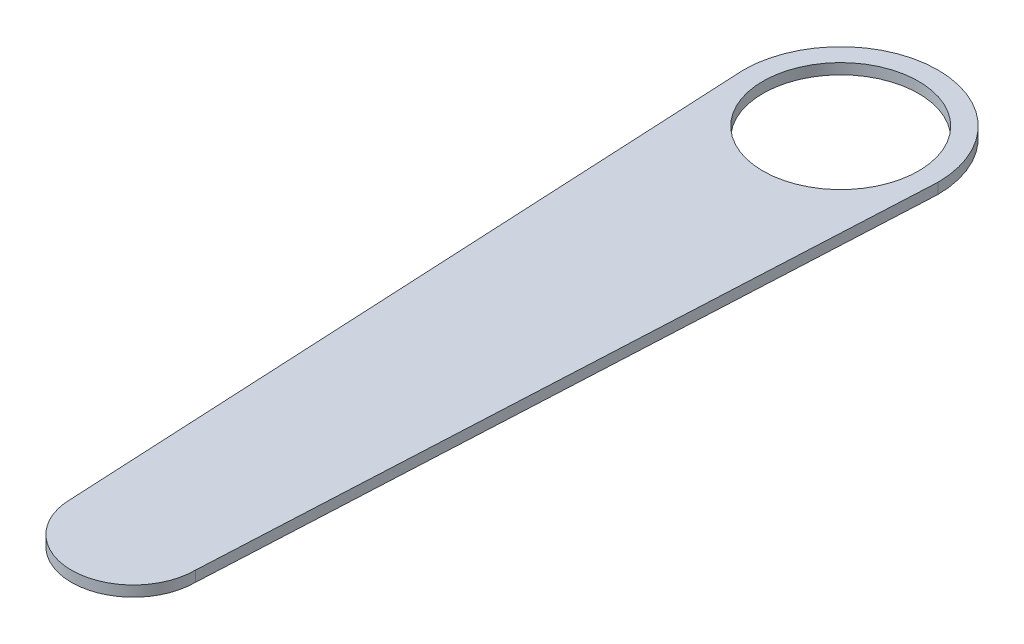
ISO-10303-21;
HEADER;
FILE_DESCRIPTION(('STEP AP214'),'2;1');
FILE_NAME('part.step','',(''),(''),'','','');
FILE_SCHEMA(('AUTOMOTIVE_DESIGN { 1 0 10303 214 1 1 1 1 }'));
ENDSEC;
DATA;
#1=APPLICATION_CONTEXT('core data for automotive mechanical design processes');
#2=APPLICATION_PROTOCOL_DEFINITION('international standard','automotive_design',2000,#1);
#3=PRODUCT_CONTEXT('',#1,'mechanical');
#4=PRODUCT('Part','Part','',(#3));
#5=PRODUCT_RELATED_PRODUCT_CATEGORY('part','',(#4));
#6=PRODUCT_DEFINITION_FORMATION('','',#4);
#7=PRODUCT_DEFINITION_CONTEXT('part definition',#1,'design');
#8=PRODUCT_DEFINITION('design','',#6,#7);
#9=PRODUCT_DEFINITION_SHAPE('','',#8);
#10=(LENGTH_UNIT() NAMED_UNIT(*) SI_UNIT(.MILLI.,.METRE.));
#11=(NAMED_UNIT(*) PLANE_ANGLE_UNIT() SI_UNIT($,.RADIAN.));
#12=(NAMED_UNIT(*) SI_UNIT($,.STERADIAN.) SOLID_ANGLE_UNIT());
#13=UNCERTAINTY_MEASURE_WITH_UNIT(LENGTH_MEASURE(1.E-05),#10,'distance_accuracy_value','');
#14=(GEOMETRIC_REPRESENTATION_CONTEXT(3) GLOBAL_UNCERTAINTY_ASSIGNED_CONTEXT((#13)) GLOBAL_UNIT_ASSIGNED_CONTEXT((#10,
#11,#12)) REPRESENTATION_CONTEXT('',''));
#15=CARTESIAN_POINT('',(0.,0.,0.));
#16=DIRECTION('',(0.,0.,1.));
#17=DIRECTION('',(1.,0.,0.));
#18=AXIS2_PLACEMENT_3D('',#15,#16,#17);
#19=CARTESIAN_POINT('',(27.431421446384,3.,1.3715710723192));
#20=DIRECTION('',(-0.998752338877845,0.,-0.0499376169438922));
#21=DIRECTION('',(-0.0499376169438922,0.,0.998752338877845));
#22=AXIS2_PLACEMENT_3D('',#19,#20,#21);
#23=PLANE('',#22);
#24=DIRECTION('',(0.0499376169438922,0.,-0.998752338877845));
#25=VECTOR('',#24,1.);
#26=CARTESIAN_POINT('',(27.431421446384,0.,1.3715710723192));
#27=LINE('',#26,#25);
#28=CARTESIAN_POINT('',(17.5,0.,200.));
#29=VERTEX_POINT('',#28);
#30=CARTESIAN_POINT('',(27.5,0.,0.));
#31=VERTEX_POINT('',#30);
#32=EDGE_CURVE('E107',#29,#31,#27,.T.);
#33=ORIENTED_EDGE('',*,*,#32,.T.);
#34=DIRECTION('',(0.,-1.,0.));
#35=VECTOR('',#34,1.);
#36=CARTESIAN_POINT('',(27.5,3.,0.));
#37=LINE('',#36,#35);
#38=CARTESIAN_POINT('',(27.5,3.,0.));
#39=VERTEX_POINT('',#38);
#40=EDGE_CURVE('E11',#39,#31,#37,.T.);
#41=ORIENTED_EDGE('',*,*,#40,.F.);
#42=DIRECTION('',(0.0499376169438922,0.,-0.998752338877845));
#43=VECTOR('',#42,1.);
#44=CARTESIAN_POINT('',(27.431421446384,3.,1.3715710723192));
#45=LINE('',#44,#43);
#46=CARTESIAN_POINT('',(17.5,3.,200.));
#47=VERTEX_POINT('',#46);
#48=EDGE_CURVE('E91',#47,#39,#45,.T.);
#49=ORIENTED_EDGE('',*,*,#48,.F.);
#50=DIRECTION('',(0.,-1.,0.));
#51=VECTOR('',#50,1.);
#52=CARTESIAN_POINT('',(17.5,3.,200.));
#53=LINE('',#52,#51);
#54=EDGE_CURVE('E103',#47,#29,#53,.T.);
#55=ORIENTED_EDGE('',*,*,#54,.T.);
#56=EDGE_LOOP('',(#33,#41,#49,#55));
#57=FACE_BOUND('',#56,.T.);
#58=ADVANCED_FACE('F39',(#57),#23,.F.);
#59=CARTESIAN_POINT('',(0.,3.,0.));
#60=DIRECTION('',(0.,-1.,0.));
#61=DIRECTION('',(0.,0.,-1.));
#62=AXIS2_PLACEMENT_3D('',#59,#60,#61);
#63=CYLINDRICAL_SURFACE('',#62,27.5);
#64=CARTESIAN_POINT('',(0.,0.,0.));
#65=DIRECTION('',(0.,1.,0.));
#66=DIRECTION('',(0.,0.,1.));
#67=AXIS2_PLACEMENT_3D('',#64,#65,#66);
#68=CIRCLE('',#67,27.5);
#69=CARTESIAN_POINT('',(-27.5,0.,0.));
#70=VERTEX_POINT('',#69);
#71=EDGE_CURVE('E96',#31,#70,#68,.T.);
#72=ORIENTED_EDGE('',*,*,#71,.T.);
#73=DIRECTION('',(0.,-1.,0.));
#74=VECTOR('',#73,1.);
#75=CARTESIAN_POINT('',(-27.5,3.,0.));
#76=LINE('',#75,#74);
#77=CARTESIAN_POINT('',(-27.5,3.,0.));
#78=VERTEX_POINT('',#77);
#79=EDGE_CURVE('E48',#78,#70,#76,.T.);
#80=ORIENTED_EDGE('',*,*,#79,.F.);
#81=CARTESIAN_POINT('',(0.,3.,0.));
#82=DIRECTION('',(0.,1.,0.));
#83=DIRECTION('',(0.,0.,1.));
#84=AXIS2_PLACEMENT_3D('',#81,#82,#83);
#85=CIRCLE('',#84,27.5);
#86=EDGE_CURVE('E86',#39,#78,#85,.T.);
#87=ORIENTED_EDGE('',*,*,#86,.F.);
#88=ORIENTED_EDGE('',*,*,#40,.T.);
#89=EDGE_LOOP('',(#72,#80,#87,#88));
#90=FACE_BOUND('',#89,.T.);
#91=ADVANCED_FACE('F95',(#90),#63,.T.);
#92=CARTESIAN_POINT('',(-27.431421446384,3.,1.3715710723192));
#93=DIRECTION('',(0.998752338877845,0.,-0.0499376169438922));
#94=DIRECTION('',(-0.0499376169438922,0.,-0.998752338877845));
#95=AXIS2_PLACEMENT_3D('',#92,#93,#94);
#96=PLANE('',#95);
#97=DIRECTION('',(0.0499376169438922,0.,0.998752338877845));
#98=VECTOR('',#97,1.);
#99=CARTESIAN_POINT('',(-27.431421446384,0.,1.3715710723192));
#100=LINE('',#99,#98);
#101=CARTESIAN_POINT('',(-17.5,0.,200.));
#102=VERTEX_POINT('',#101);
#103=EDGE_CURVE('E73',#70,#102,#100,.T.);
#104=ORIENTED_EDGE('',*,*,#103,.T.);
#105=DIRECTION('',(0.,-1.,0.));
#106=VECTOR('',#105,1.);
#107=CARTESIAN_POINT('',(-17.5,3.,200.));
#108=LINE('',#107,#106);
#109=CARTESIAN_POINT('',(-17.5,3.,200.));
#110=VERTEX_POINT('',#109);
#111=EDGE_CURVE('E98',#110,#102,#108,.T.);
#112=ORIENTED_EDGE('',*,*,#111,.F.);
#113=DIRECTION('',(0.0499376169438922,0.,0.998752338877845));
#114=VECTOR('',#113,1.);
#115=CARTESIAN_POINT('',(-27.431421446384,3.,1.3715710723192));
#116=LINE('',#115,#114);
#117=EDGE_CURVE('E89',#78,#110,#116,.T.);
#118=ORIENTED_EDGE('',*,*,#117,.F.);
#119=ORIENTED_EDGE('',*,*,#79,.T.);
#120=EDGE_LOOP('',(#104,#112,#118,#119));
#121=FACE_BOUND('',#120,.T.);
#122=ADVANCED_FACE('F99',(#121),#96,.F.);
#123=CARTESIAN_POINT('',(0.,3.,200.));
#124=DIRECTION('',(0.,-1.,0.));
#125=DIRECTION('',(0.,0.,-1.));
#126=AXIS2_PLACEMENT_3D('',#123,#124,#125);
#127=CYLINDRICAL_SURFACE('',#126,17.5);
#128=CARTESIAN_POINT('',(0.,0.,200.));
#129=DIRECTION('',(0.,1.,0.));
#130=DIRECTION('',(0.,0.,1.));
#131=AXIS2_PLACEMENT_3D('',#128,#129,#130);
#132=CIRCLE('',#131,17.5);
#133=EDGE_CURVE('E79',#102,#29,#132,.T.);
#134=ORIENTED_EDGE('',*,*,#133,.T.);
#135=ORIENTED_EDGE('',*,*,#54,.F.);
#136=CARTESIAN_POINT('',(0.,3.,200.));
#137=DIRECTION('',(0.,1.,0.));
#138=DIRECTION('',(0.,0.,1.));
#139=AXIS2_PLACEMENT_3D('',#136,#137,#138);
#140=CIRCLE('',#139,17.5);
#141=EDGE_CURVE('E56',#110,#47,#140,.T.);
#142=ORIENTED_EDGE('',*,*,#141,.F.);
#143=ORIENTED_EDGE('',*,*,#111,.T.);
#144=EDGE_LOOP('',(#134,#135,#142,#143));
#145=FACE_BOUND('',#144,.T.);
#146=ADVANCED_FACE('F121',(#145),#127,.T.);
#147=CARTESIAN_POINT('',(0.,3.,0.));
#148=DIRECTION('',(0.,1.,0.));
#149=DIRECTION('',(0.,0.,1.));
#150=AXIS2_PLACEMENT_3D('',#147,#148,#149);
#151=PLANE('',#150);
#152=CARTESIAN_POINT('',(0.,3.,0.));
#153=DIRECTION('',(0.,1.,0.));
#154=DIRECTION('',(0.,0.,1.));
#155=AXIS2_PLACEMENT_3D('',#152,#153,#154);
#156=CIRCLE('',#155,22.);
#157=CARTESIAN_POINT('',(0.,3.,22.));
#158=VERTEX_POINT('',#157);
#159=EDGE_CURVE('E128',#158,#158,#156,.T.);
#160=ORIENTED_EDGE('',*,*,#159,.F.);
#161=EDGE_LOOP('',(#160));
#162=FACE_BOUND('',#161,.T.);
#163=ORIENTED_EDGE('',*,*,#48,.T.);
#164=ORIENTED_EDGE('',*,*,#86,.T.);
#165=ORIENTED_EDGE('',*,*,#117,.T.);
#166=ORIENTED_EDGE('',*,*,#141,.T.);
#167=EDGE_LOOP('',(#163,#164,#165,#166));
#168=FACE_BOUND('',#167,.T.);
#169=ADVANCED_FACE('F87',(#162,#168),#151,.T.);
#170=CARTESIAN_POINT('',(0.,0.,0.));
#171=DIRECTION('',(0.,1.,0.));
#172=DIRECTION('',(0.,0.,1.));
#173=AXIS2_PLACEMENT_3D('',#170,#171,#172);
#174=PLANE('',#173);
#175=CARTESIAN_POINT('',(0.,0.,0.));
#176=DIRECTION('',(0.,1.,0.));
#177=DIRECTION('',(0.,0.,1.));
#178=AXIS2_PLACEMENT_3D('',#175,#176,#177);
#179=CIRCLE('',#178,22.);
#180=CARTESIAN_POINT('',(0.,0.,22.));
#181=VERTEX_POINT('',#180);
#182=EDGE_CURVE('E111',#181,#181,#179,.T.);
#183=ORIENTED_EDGE('',*,*,#182,.T.);
#184=EDGE_LOOP('',(#183));
#185=FACE_BOUND('',#184,.T.);
#186=ORIENTED_EDGE('',*,*,#32,.F.);
#187=ORIENTED_EDGE('',*,*,#133,.F.);
#188=ORIENTED_EDGE('',*,*,#103,.F.);
#189=ORIENTED_EDGE('',*,*,#71,.F.);
#190=EDGE_LOOP('',(#186,#187,#188,#189));
#191=FACE_BOUND('',#190,.T.);
#192=ADVANCED_FACE('F124',(#185,#191),#174,.F.);
#193=CARTESIAN_POINT('',(0.,0.,0.));
#194=DIRECTION('',(0.,1.,0.));
#195=DIRECTION('',(0.,0.,1.));
#196=AXIS2_PLACEMENT_3D('',#193,#194,#195);
#197=CYLINDRICAL_SURFACE('',#196,22.);
#198=ORIENTED_EDGE('',*,*,#182,.F.);
#199=EDGE_LOOP('',(#198));
#200=FACE_BOUND('',#199,.T.);
#201=ORIENTED_EDGE('',*,*,#159,.T.);
#202=EDGE_LOOP('',(#201));
#203=FACE_BOUND('',#202,.T.);
#204=ADVANCED_FACE('F137',(#200,#203),#197,.F.);
#205=CLOSED_SHELL('',(#58,#91,#122,#146,#169,#192,#204));
#206=MANIFOLD_SOLID_BREP('B2',#205);
#207=ADVANCED_BREP_SHAPE_REPRESENTATION('',(#18,#206),#14);
#208=SHAPE_DEFINITION_REPRESENTATION(#9,#207);
ENDSEC;
END-ISO-10303-21;
